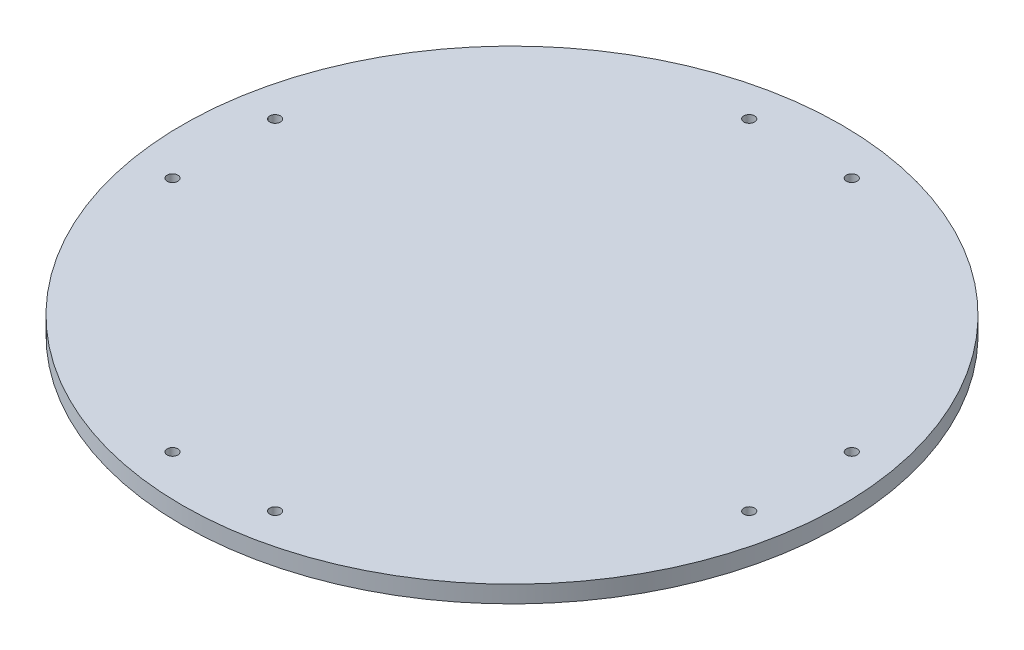
ISO-10303-21;
HEADER;
FILE_DESCRIPTION(('STEP AP214'),'2;1');
FILE_NAME('part.step','',(''),(''),'','','');
FILE_SCHEMA(('AUTOMOTIVE_DESIGN { 1 0 10303 214 1 1 1 1 }'));
ENDSEC;
DATA;
#1=APPLICATION_CONTEXT('core data for automotive mechanical design processes');
#2=APPLICATION_PROTOCOL_DEFINITION('international standard','automotive_design',2000,#1);
#3=PRODUCT_CONTEXT('',#1,'mechanical');
#4=PRODUCT('Part','Part','',(#3));
#5=PRODUCT_RELATED_PRODUCT_CATEGORY('part','',(#4));
#6=PRODUCT_DEFINITION_FORMATION('','',#4);
#7=PRODUCT_DEFINITION_CONTEXT('part definition',#1,'design');
#8=PRODUCT_DEFINITION('design','',#6,#7);
#9=PRODUCT_DEFINITION_SHAPE('','',#8);
#10=(LENGTH_UNIT() NAMED_UNIT(*) SI_UNIT(.MILLI.,.METRE.));
#11=(NAMED_UNIT(*) PLANE_ANGLE_UNIT() SI_UNIT($,.RADIAN.));
#12=(NAMED_UNIT(*) SI_UNIT($,.STERADIAN.) SOLID_ANGLE_UNIT());
#13=UNCERTAINTY_MEASURE_WITH_UNIT(LENGTH_MEASURE(1.E-05),#10,'distance_accuracy_value','');
#14=(GEOMETRIC_REPRESENTATION_CONTEXT(3) GLOBAL_UNCERTAINTY_ASSIGNED_CONTEXT((#13)) GLOBAL_UNIT_ASSIGNED_CONTEXT((#10,
#11,#12)) REPRESENTATION_CONTEXT('',''));
#15=CARTESIAN_POINT('',(0.,0.,0.));
#16=DIRECTION('',(0.,0.,1.));
#17=DIRECTION('',(1.,0.,0.));
#18=AXIS2_PLACEMENT_3D('',#15,#16,#17);
#19=CARTESIAN_POINT('',(0.,6.35,0.));
#20=DIRECTION('',(0.,-1.,0.));
#21=DIRECTION('',(0.,0.,-1.));
#22=AXIS2_PLACEMENT_3D('',#19,#20,#21);
#23=CYLINDRICAL_SURFACE('',#22,122.4);
#24=CARTESIAN_POINT('',(0.,6.35,0.));
#25=DIRECTION('',(0.,1.,0.));
#26=DIRECTION('',(0.,0.,1.));
#27=AXIS2_PLACEMENT_3D('',#24,#25,#26);
#28=CIRCLE('',#27,122.4);
#29=CARTESIAN_POINT('',(0.,6.35,122.4));
#30=VERTEX_POINT('',#29);
#31=EDGE_CURVE('E10',#30,#30,#28,.T.);
#32=ORIENTED_EDGE('',*,*,#31,.F.);
#33=EDGE_LOOP('',(#32));
#34=FACE_BOUND('',#33,.T.);
#35=CARTESIAN_POINT('',(0.,0.,0.));
#36=DIRECTION('',(0.,1.,0.));
#37=DIRECTION('',(0.,0.,1.));
#38=AXIS2_PLACEMENT_3D('',#35,#36,#37);
#39=CIRCLE('',#38,122.4);
#40=CARTESIAN_POINT('',(0.,0.,122.4));
#41=VERTEX_POINT('',#40);
#42=EDGE_CURVE('E33',#41,#41,#39,.T.);
#43=ORIENTED_EDGE('',*,*,#42,.T.);
#44=EDGE_LOOP('',(#43));
#45=FACE_BOUND('',#44,.T.);
#46=ADVANCED_FACE('F30',(#34,#45),#23,.T.);
#47=CARTESIAN_POINT('',(0.,6.35,0.));
#48=DIRECTION('',(0.,1.,0.));
#49=DIRECTION('',(0.,0.,1.));
#50=AXIS2_PLACEMENT_3D('',#47,#48,#49);
#51=PLANE('',#50);
#52=CARTESIAN_POINT('',(-107.09237909833,6.35,18.9931628263646));
#53=DIRECTION('',(0.,1.,0.));
#54=DIRECTION('',(-1.,0.,0.));
#55=AXIS2_PLACEMENT_3D('',#52,#53,#54);
#56=CIRCLE('',#55,1.99389999999999);
#57=CARTESIAN_POINT('',(-109.08627909833,6.35,18.9931628263646));
#58=VERTEX_POINT('',#57);
#59=EDGE_CURVE('E60',#58,#58,#56,.T.);
#60=ORIENTED_EDGE('',*,*,#59,.F.);
#61=EDGE_LOOP('',(#60));
#62=FACE_BOUND('',#61,.T.);
#63=CARTESIAN_POINT('',(-107.09237909833,6.35,-19.1068371736354));
#64=DIRECTION('',(0.,1.,0.));
#65=DIRECTION('',(-1.,0.,0.));
#66=AXIS2_PLACEMENT_3D('',#63,#64,#65);
#67=CIRCLE('',#66,1.99389999999999);
#68=CARTESIAN_POINT('',(-109.08627909833,6.35,-19.1068371736354));
#69=VERTEX_POINT('',#68);
#70=EDGE_CURVE('E66',#69,#69,#67,.T.);
#71=ORIENTED_EDGE('',*,*,#70,.F.);
#72=EDGE_LOOP('',(#71));
#73=FACE_BOUND('',#72,.T.);
#74=CARTESIAN_POINT('',(-19.05,6.35,-107.149216271966));
#75=DIRECTION('',(0.,1.,0.));
#76=DIRECTION('',(0.,0.,-1.));
#77=AXIS2_PLACEMENT_3D('',#74,#75,#76);
#78=CIRCLE('',#77,1.99389999999999);
#79=CARTESIAN_POINT('',(-19.05,6.35,-109.143116271966));
#80=VERTEX_POINT('',#79);
#81=EDGE_CURVE('E72',#80,#80,#78,.T.);
#82=ORIENTED_EDGE('',*,*,#81,.F.);
#83=EDGE_LOOP('',(#82));
#84=FACE_BOUND('',#83,.T.);
#85=CARTESIAN_POINT('',(19.05,6.35,-107.149216271966));
#86=DIRECTION('',(0.,1.,0.));
#87=DIRECTION('',(0.,0.,-1.));
#88=AXIS2_PLACEMENT_3D('',#85,#86,#87);
#89=CIRCLE('',#88,1.99389999999999);
#90=CARTESIAN_POINT('',(19.05,6.35,-109.143116271966));
#91=VERTEX_POINT('',#90);
#92=EDGE_CURVE('E78',#91,#91,#89,.T.);
#93=ORIENTED_EDGE('',*,*,#92,.F.);
#94=EDGE_LOOP('',(#93));
#95=FACE_BOUND('',#94,.T.);
#96=CARTESIAN_POINT('',(107.09237909833,6.35,-19.1068371736369));
#97=DIRECTION('',(0.,1.,0.));
#98=DIRECTION('',(1.,0.,0.));
#99=AXIS2_PLACEMENT_3D('',#96,#97,#98);
#100=CIRCLE('',#99,1.99389999999999);
#101=CARTESIAN_POINT('',(109.08627909833,6.35,-19.1068371736369));
#102=VERTEX_POINT('',#101);
#103=EDGE_CURVE('E84',#102,#102,#100,.T.);
#104=ORIENTED_EDGE('',*,*,#103,.F.);
#105=EDGE_LOOP('',(#104));
#106=FACE_BOUND('',#105,.T.);
#107=CARTESIAN_POINT('',(107.09237909833,6.35,18.9931628263631));
#108=DIRECTION('',(0.,1.,0.));
#109=DIRECTION('',(1.,0.,0.));
#110=AXIS2_PLACEMENT_3D('',#107,#108,#109);
#111=CIRCLE('',#110,1.99389999999999);
#112=CARTESIAN_POINT('',(109.08627909833,6.35,18.9931628263631));
#113=VERTEX_POINT('',#112);
#114=EDGE_CURVE('E54',#113,#113,#111,.T.);
#115=ORIENTED_EDGE('',*,*,#114,.F.);
#116=EDGE_LOOP('',(#115));
#117=FACE_BOUND('',#116,.T.);
#118=CARTESIAN_POINT('',(-19.05,6.35,107.035541924693));
#119=DIRECTION('',(0.,1.,0.));
#120=DIRECTION('',(0.,0.,1.));
#121=AXIS2_PLACEMENT_3D('',#118,#119,#120);
#122=CIRCLE('',#121,1.99389999999999);
#123=CARTESIAN_POINT('',(-19.05,6.35,109.029441924693));
#124=VERTEX_POINT('',#123);
#125=EDGE_CURVE('E49',#124,#124,#122,.T.);
#126=ORIENTED_EDGE('',*,*,#125,.F.);
#127=EDGE_LOOP('',(#126));
#128=FACE_BOUND('',#127,.T.);
#129=CARTESIAN_POINT('',(19.05,6.35,107.035541924693));
#130=DIRECTION('',(0.,1.,0.));
#131=DIRECTION('',(0.,0.,1.));
#132=AXIS2_PLACEMENT_3D('',#129,#130,#131);
#133=CIRCLE('',#132,1.99389999999999);
#134=CARTESIAN_POINT('',(19.05,6.35,109.029441924693));
#135=VERTEX_POINT('',#134);
#136=EDGE_CURVE('E42',#135,#135,#133,.T.);
#137=ORIENTED_EDGE('',*,*,#136,.F.);
#138=EDGE_LOOP('',(#137));
#139=FACE_BOUND('',#138,.T.);
#140=ORIENTED_EDGE('',*,*,#31,.T.);
#141=EDGE_LOOP('',(#140));
#142=FACE_BOUND('',#141,.T.);
#143=ADVANCED_FACE('F101',(#62,#73,#84,#95,#106,#117,#128,#139,#142),#51,.T.);
#144=CARTESIAN_POINT('',(0.,0.,0.));
#145=DIRECTION('',(0.,1.,0.));
#146=DIRECTION('',(0.,0.,1.));
#147=AXIS2_PLACEMENT_3D('',#144,#145,#146);
#148=PLANE('',#147);
#149=CARTESIAN_POINT('',(-107.09237909833,0.,18.9931628263646));
#150=DIRECTION('',(0.,1.,0.));
#151=DIRECTION('',(-1.,0.,0.));
#152=AXIS2_PLACEMENT_3D('',#149,#150,#151);
#153=CIRCLE('',#152,1.99389999999999);
#154=CARTESIAN_POINT('',(-109.08627909833,0.,18.9931628263646));
#155=VERTEX_POINT('',#154);
#156=EDGE_CURVE('E63',#155,#155,#153,.T.);
#157=ORIENTED_EDGE('',*,*,#156,.T.);
#158=EDGE_LOOP('',(#157));
#159=FACE_BOUND('',#158,.T.);
#160=CARTESIAN_POINT('',(-107.09237909833,0.,-19.1068371736354));
#161=DIRECTION('',(0.,1.,0.));
#162=DIRECTION('',(-1.,0.,0.));
#163=AXIS2_PLACEMENT_3D('',#160,#161,#162);
#164=CIRCLE('',#163,1.99389999999999);
#165=CARTESIAN_POINT('',(-109.08627909833,0.,-19.1068371736354));
#166=VERTEX_POINT('',#165);
#167=EDGE_CURVE('E69',#166,#166,#164,.T.);
#168=ORIENTED_EDGE('',*,*,#167,.T.);
#169=EDGE_LOOP('',(#168));
#170=FACE_BOUND('',#169,.T.);
#171=CARTESIAN_POINT('',(-19.05,0.,-107.149216271966));
#172=DIRECTION('',(0.,1.,0.));
#173=DIRECTION('',(0.,0.,-1.));
#174=AXIS2_PLACEMENT_3D('',#171,#172,#173);
#175=CIRCLE('',#174,1.99389999999999);
#176=CARTESIAN_POINT('',(-19.05,0.,-109.143116271966));
#177=VERTEX_POINT('',#176);
#178=EDGE_CURVE('E75',#177,#177,#175,.T.);
#179=ORIENTED_EDGE('',*,*,#178,.T.);
#180=EDGE_LOOP('',(#179));
#181=FACE_BOUND('',#180,.T.);
#182=CARTESIAN_POINT('',(19.05,0.,-107.149216271966));
#183=DIRECTION('',(0.,1.,0.));
#184=DIRECTION('',(0.,0.,-1.));
#185=AXIS2_PLACEMENT_3D('',#182,#183,#184);
#186=CIRCLE('',#185,1.99389999999999);
#187=CARTESIAN_POINT('',(19.05,0.,-109.143116271966));
#188=VERTEX_POINT('',#187);
#189=EDGE_CURVE('E81',#188,#188,#186,.T.);
#190=ORIENTED_EDGE('',*,*,#189,.T.);
#191=EDGE_LOOP('',(#190));
#192=FACE_BOUND('',#191,.T.);
#193=CARTESIAN_POINT('',(107.09237909833,0.,-19.1068371736369));
#194=DIRECTION('',(0.,1.,0.));
#195=DIRECTION('',(1.,0.,0.));
#196=AXIS2_PLACEMENT_3D('',#193,#194,#195);
#197=CIRCLE('',#196,1.99389999999999);
#198=CARTESIAN_POINT('',(109.08627909833,0.,-19.1068371736369));
#199=VERTEX_POINT('',#198);
#200=EDGE_CURVE('E57',#199,#199,#197,.T.);
#201=ORIENTED_EDGE('',*,*,#200,.T.);
#202=EDGE_LOOP('',(#201));
#203=FACE_BOUND('',#202,.T.);
#204=CARTESIAN_POINT('',(107.09237909833,0.,18.9931628263631));
#205=DIRECTION('',(0.,1.,0.));
#206=DIRECTION('',(1.,0.,0.));
#207=AXIS2_PLACEMENT_3D('',#204,#205,#206);
#208=CIRCLE('',#207,1.99389999999999);
#209=CARTESIAN_POINT('',(109.08627909833,0.,18.9931628263631));
#210=VERTEX_POINT('',#209);
#211=EDGE_CURVE('E46',#210,#210,#208,.T.);
#212=ORIENTED_EDGE('',*,*,#211,.T.);
#213=EDGE_LOOP('',(#212));
#214=FACE_BOUND('',#213,.T.);
#215=CARTESIAN_POINT('',(-19.05,0.,107.035541924693));
#216=DIRECTION('',(0.,1.,0.));
#217=DIRECTION('',(0.,0.,1.));
#218=AXIS2_PLACEMENT_3D('',#215,#216,#217);
#219=CIRCLE('',#218,1.99389999999999);
#220=CARTESIAN_POINT('',(-19.05,0.,109.029441924693));
#221=VERTEX_POINT('',#220);
#222=EDGE_CURVE('E40',#221,#221,#219,.T.);
#223=ORIENTED_EDGE('',*,*,#222,.T.);
#224=EDGE_LOOP('',(#223));
#225=FACE_BOUND('',#224,.T.);
#226=CARTESIAN_POINT('',(19.05,0.,107.035541924693));
#227=DIRECTION('',(0.,1.,0.));
#228=DIRECTION('',(0.,0.,1.));
#229=AXIS2_PLACEMENT_3D('',#226,#227,#228);
#230=CIRCLE('',#229,1.99389999999999);
#231=CARTESIAN_POINT('',(19.05,0.,109.029441924693));
#232=VERTEX_POINT('',#231);
#233=EDGE_CURVE('E45',#232,#232,#230,.T.);
#234=ORIENTED_EDGE('',*,*,#233,.T.);
#235=EDGE_LOOP('',(#234));
#236=FACE_BOUND('',#235,.T.);
#237=ORIENTED_EDGE('',*,*,#42,.F.);
#238=EDGE_LOOP('',(#237));
#239=FACE_BOUND('',#238,.T.);
#240=ADVANCED_FACE('F90',(#159,#170,#181,#192,#203,#214,#225,#236,#239),#148,.F.);
#241=CARTESIAN_POINT('',(19.05,0.,107.035541924693));
#242=DIRECTION('',(0.,1.,0.));
#243=DIRECTION('',(0.,0.,1.));
#244=AXIS2_PLACEMENT_3D('',#241,#242,#243);
#245=CYLINDRICAL_SURFACE('',#244,1.99389999999999);
#246=ORIENTED_EDGE('',*,*,#233,.F.);
#247=EDGE_LOOP('',(#246));
#248=FACE_BOUND('',#247,.T.);
#249=ORIENTED_EDGE('',*,*,#136,.T.);
#250=EDGE_LOOP('',(#249));
#251=FACE_BOUND('',#250,.T.);
#252=ADVANCED_FACE('F112',(#248,#251),#245,.F.);
#253=CARTESIAN_POINT('',(-19.05,0.,107.035541924693));
#254=DIRECTION('',(0.,1.,0.));
#255=DIRECTION('',(0.,0.,1.));
#256=AXIS2_PLACEMENT_3D('',#253,#254,#255);
#257=CYLINDRICAL_SURFACE('',#256,1.99389999999999);
#258=ORIENTED_EDGE('',*,*,#222,.F.);
#259=EDGE_LOOP('',(#258));
#260=FACE_BOUND('',#259,.T.);
#261=ORIENTED_EDGE('',*,*,#125,.T.);
#262=EDGE_LOOP('',(#261));
#263=FACE_BOUND('',#262,.T.);
#264=ADVANCED_FACE('F114',(#260,#263),#257,.F.);
#265=CARTESIAN_POINT('',(107.09237909833,0.,18.9931628263631));
#266=DIRECTION('',(0.,1.,0.));
#267=DIRECTION('',(0.,0.,1.));
#268=AXIS2_PLACEMENT_3D('',#265,#266,#267);
#269=CYLINDRICAL_SURFACE('',#268,1.99389999999999);
#270=ORIENTED_EDGE('',*,*,#211,.F.);
#271=EDGE_LOOP('',(#270));
#272=FACE_BOUND('',#271,.T.);
#273=ORIENTED_EDGE('',*,*,#114,.T.);
#274=EDGE_LOOP('',(#273));
#275=FACE_BOUND('',#274,.T.);
#276=ADVANCED_FACE('F97',(#272,#275),#269,.F.);
#277=CARTESIAN_POINT('',(107.09237909833,0.,-19.1068371736369));
#278=DIRECTION('',(0.,1.,0.));
#279=DIRECTION('',(0.,0.,1.));
#280=AXIS2_PLACEMENT_3D('',#277,#278,#279);
#281=CYLINDRICAL_SURFACE('',#280,1.99389999999999);
#282=ORIENTED_EDGE('',*,*,#200,.F.);
#283=EDGE_LOOP('',(#282));
#284=FACE_BOUND('',#283,.T.);
#285=ORIENTED_EDGE('',*,*,#103,.T.);
#286=EDGE_LOOP('',(#285));
#287=FACE_BOUND('',#286,.T.);
#288=ADVANCED_FACE('F93',(#284,#287),#281,.F.);
#289=CARTESIAN_POINT('',(19.05,0.,-107.149216271966));
#290=DIRECTION('',(0.,1.,0.));
#291=DIRECTION('',(0.,0.,1.));
#292=AXIS2_PLACEMENT_3D('',#289,#290,#291);
#293=CYLINDRICAL_SURFACE('',#292,1.99389999999999);
#294=ORIENTED_EDGE('',*,*,#189,.F.);
#295=EDGE_LOOP('',(#294));
#296=FACE_BOUND('',#295,.T.);
#297=ORIENTED_EDGE('',*,*,#92,.T.);
#298=EDGE_LOOP('',(#297));
#299=FACE_BOUND('',#298,.T.);
#300=ADVANCED_FACE('F96',(#296,#299),#293,.F.);
#301=CARTESIAN_POINT('',(-19.05,0.,-107.149216271966));
#302=DIRECTION('',(0.,1.,0.));
#303=DIRECTION('',(0.,0.,1.));
#304=AXIS2_PLACEMENT_3D('',#301,#302,#303);
#305=CYLINDRICAL_SURFACE('',#304,1.99389999999999);
#306=ORIENTED_EDGE('',*,*,#178,.F.);
#307=EDGE_LOOP('',(#306));
#308=FACE_BOUND('',#307,.T.);
#309=ORIENTED_EDGE('',*,*,#81,.T.);
#310=EDGE_LOOP('',(#309));
#311=FACE_BOUND('',#310,.T.);
#312=ADVANCED_FACE('F167',(#308,#311),#305,.F.);
#313=CARTESIAN_POINT('',(-107.09237909833,0.,-19.1068371736354));
#314=DIRECTION('',(0.,1.,0.));
#315=DIRECTION('',(0.,0.,1.));
#316=AXIS2_PLACEMENT_3D('',#313,#314,#315);
#317=CYLINDRICAL_SURFACE('',#316,1.99389999999999);
#318=ORIENTED_EDGE('',*,*,#167,.F.);
#319=EDGE_LOOP('',(#318));
#320=FACE_BOUND('',#319,.T.);
#321=ORIENTED_EDGE('',*,*,#70,.T.);
#322=EDGE_LOOP('',(#321));
#323=FACE_BOUND('',#322,.T.);
#324=ADVANCED_FACE('F177',(#320,#323),#317,.F.);
#325=CARTESIAN_POINT('',(-107.09237909833,0.,18.9931628263646));
#326=DIRECTION('',(0.,1.,0.));
#327=DIRECTION('',(0.,0.,1.));
#328=AXIS2_PLACEMENT_3D('',#325,#326,#327);
#329=CYLINDRICAL_SURFACE('',#328,1.99389999999999);
#330=ORIENTED_EDGE('',*,*,#156,.F.);
#331=EDGE_LOOP('',(#330));
#332=FACE_BOUND('',#331,.T.);
#333=ORIENTED_EDGE('',*,*,#59,.T.);
#334=EDGE_LOOP('',(#333));
#335=FACE_BOUND('',#334,.T.);
#336=ADVANCED_FACE('F187',(#332,#335),#329,.F.);
#337=CLOSED_SHELL('',(#46,#143,#240,#252,#264,#276,#288,#300,#312,#324,#336));
#338=MANIFOLD_SOLID_BREP('B2',#337);
#339=ADVANCED_BREP_SHAPE_REPRESENTATION('',(#18,#338),#14);
#340=SHAPE_DEFINITION_REPRESENTATION(#9,#339);
ENDSEC;
END-ISO-10303-21;
